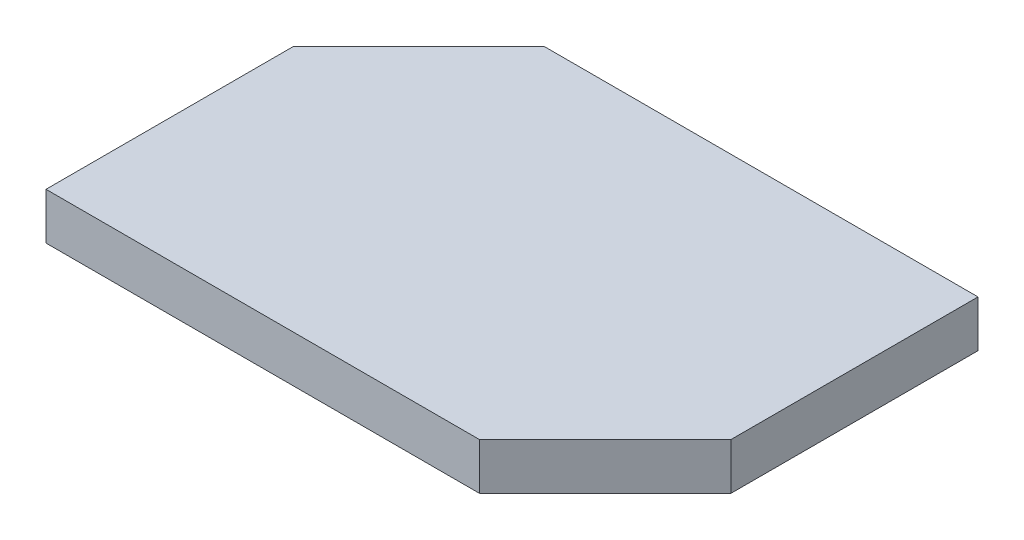
ISO-10303-21;
HEADER;
FILE_DESCRIPTION(('STEP AP214'),'2;1');
FILE_NAME('part.step','',(''),(''),'','','');
FILE_SCHEMA(('AUTOMOTIVE_DESIGN { 1 0 10303 214 1 1 1 1 }'));
ENDSEC;
DATA;
#1=APPLICATION_CONTEXT('core data for automotive mechanical design processes');
#2=APPLICATION_PROTOCOL_DEFINITION('international standard','automotive_design',2000,#1);
#3=PRODUCT_CONTEXT('',#1,'mechanical');
#4=PRODUCT('Part','Part','',(#3));
#5=PRODUCT_RELATED_PRODUCT_CATEGORY('part','',(#4));
#6=PRODUCT_DEFINITION_FORMATION('','',#4);
#7=PRODUCT_DEFINITION_CONTEXT('part definition',#1,'design');
#8=PRODUCT_DEFINITION('design','',#6,#7);
#9=PRODUCT_DEFINITION_SHAPE('','',#8);
#10=(LENGTH_UNIT() NAMED_UNIT(*) SI_UNIT(.MILLI.,.METRE.));
#11=(NAMED_UNIT(*) PLANE_ANGLE_UNIT() SI_UNIT($,.RADIAN.));
#12=(NAMED_UNIT(*) SI_UNIT($,.STERADIAN.) SOLID_ANGLE_UNIT());
#13=UNCERTAINTY_MEASURE_WITH_UNIT(LENGTH_MEASURE(1.E-05),#10,'distance_accuracy_value','');
#14=(GEOMETRIC_REPRESENTATION_CONTEXT(3) GLOBAL_UNCERTAINTY_ASSIGNED_CONTEXT((#13)) GLOBAL_UNIT_ASSIGNED_CONTEXT((#10,
#11,#12)) REPRESENTATION_CONTEXT('',''));
#15=CARTESIAN_POINT('',(0.,0.,0.));
#16=DIRECTION('',(0.,0.,1.));
#17=DIRECTION('',(1.,0.,0.));
#18=AXIS2_PLACEMENT_3D('',#15,#16,#17);
#19=CARTESIAN_POINT('',(-0.6,0.1,-0.4));
#20=DIRECTION('',(1.,0.,0.));
#21=DIRECTION('',(0.,0.,-1.));
#22=AXIS2_PLACEMENT_3D('',#19,#20,#21);
#23=PLANE('',#22);
#24=DIRECTION('',(0.,0.,1.));
#25=VECTOR('',#24,1.);
#26=CARTESIAN_POINT('',(-0.6,0.1,-0.4));
#27=LINE('',#26,#25);
#28=CARTESIAN_POINT('',(-0.6,0.1,-0.13));
#29=VERTEX_POINT('',#28);
#30=CARTESIAN_POINT('',(-0.6,0.1,0.4));
#31=VERTEX_POINT('',#30);
#32=EDGE_CURVE('E84',#29,#31,#27,.T.);
#33=ORIENTED_EDGE('',*,*,#32,.F.);
#34=DIRECTION('',(0.,-1.,0.));
#35=VECTOR('',#34,1.);
#36=CARTESIAN_POINT('',(-0.6,0.1,-0.13));
#37=LINE('',#36,#35);
#38=CARTESIAN_POINT('',(-0.6,0.,-0.13));
#39=VERTEX_POINT('',#38);
#40=EDGE_CURVE('E122',#29,#39,#37,.T.);
#41=ORIENTED_EDGE('',*,*,#40,.T.);
#42=DIRECTION('',(0.,0.,1.));
#43=VECTOR('',#42,1.);
#44=CARTESIAN_POINT('',(-0.6,0.,-0.4));
#45=LINE('',#44,#43);
#46=CARTESIAN_POINT('',(-0.6,0.,0.4));
#47=VERTEX_POINT('',#46);
#48=EDGE_CURVE('E105',#39,#47,#45,.T.);
#49=ORIENTED_EDGE('',*,*,#48,.T.);
#50=DIRECTION('',(0.,-1.,0.));
#51=VECTOR('',#50,1.);
#52=CARTESIAN_POINT('',(-0.6,0.1,0.4));
#53=LINE('',#52,#51);
#54=EDGE_CURVE('E100',#31,#47,#53,.T.);
#55=ORIENTED_EDGE('',*,*,#54,.F.);
#56=EDGE_LOOP('',(#33,#41,#49,#55));
#57=FACE_BOUND('',#56,.T.);
#58=ADVANCED_FACE('F31',(#57),#23,.F.);
#59=CARTESIAN_POINT('',(-0.6,0.1,0.4));
#60=DIRECTION('',(0.,0.,-1.));
#61=DIRECTION('',(-1.,0.,0.));
#62=AXIS2_PLACEMENT_3D('',#59,#60,#61);
#63=PLANE('',#62);
#64=DIRECTION('',(1.,0.,0.));
#65=VECTOR('',#64,1.);
#66=CARTESIAN_POINT('',(-0.6,0.,0.4));
#67=LINE('',#66,#65);
#68=CARTESIAN_POINT('',(0.329999999999999,0.,0.4));
#69=VERTEX_POINT('',#68);
#70=EDGE_CURVE('E126',#47,#69,#67,.T.);
#71=ORIENTED_EDGE('',*,*,#70,.T.);
#72=DIRECTION('',(0.,1.,0.));
#73=VECTOR('',#72,1.);
#74=CARTESIAN_POINT('',(0.329999999999999,0.1,0.4));
#75=LINE('',#74,#73);
#76=CARTESIAN_POINT('',(0.329999999999999,0.1,0.4));
#77=VERTEX_POINT('',#76);
#78=EDGE_CURVE('E102',#69,#77,#75,.T.);
#79=ORIENTED_EDGE('',*,*,#78,.T.);
#80=DIRECTION('',(1.,0.,0.));
#81=VECTOR('',#80,1.);
#82=CARTESIAN_POINT('',(-0.6,0.1,0.4));
#83=LINE('',#82,#81);
#84=EDGE_CURVE('E87',#31,#77,#83,.T.);
#85=ORIENTED_EDGE('',*,*,#84,.F.);
#86=ORIENTED_EDGE('',*,*,#54,.T.);
#87=EDGE_LOOP('',(#71,#79,#85,#86));
#88=FACE_BOUND('',#87,.T.);
#89=ADVANCED_FACE('F99',(#88),#63,.F.);
#90=CARTESIAN_POINT('',(0.6,0.1,-0.4));
#91=DIRECTION('',(-1.,0.,0.));
#92=DIRECTION('',(0.,0.,1.));
#93=AXIS2_PLACEMENT_3D('',#90,#91,#92);
#94=PLANE('',#93);
#95=DIRECTION('',(0.,0.,-1.));
#96=VECTOR('',#95,1.);
#97=CARTESIAN_POINT('',(0.6,0.1,-0.4));
#98=LINE('',#97,#96);
#99=CARTESIAN_POINT('',(0.6,0.1,0.13));
#100=VERTEX_POINT('',#99);
#101=CARTESIAN_POINT('',(0.6,0.1,-0.4));
#102=VERTEX_POINT('',#101);
#103=EDGE_CURVE('E103',#100,#102,#98,.T.);
#104=ORIENTED_EDGE('',*,*,#103,.F.);
#105=DIRECTION('',(0.,-1.,0.));
#106=VECTOR('',#105,1.);
#107=CARTESIAN_POINT('',(0.6,0.1,0.13));
#108=LINE('',#107,#106);
#109=CARTESIAN_POINT('',(0.6,0.,0.13));
#110=VERTEX_POINT('',#109);
#111=EDGE_CURVE('E107',#100,#110,#108,.T.);
#112=ORIENTED_EDGE('',*,*,#111,.T.);
#113=DIRECTION('',(0.,0.,-1.));
#114=VECTOR('',#113,1.);
#115=CARTESIAN_POINT('',(0.6,0.,-0.4));
#116=LINE('',#115,#114);
#117=CARTESIAN_POINT('',(0.6,0.,-0.4));
#118=VERTEX_POINT('',#117);
#119=EDGE_CURVE('E128',#110,#118,#116,.T.);
#120=ORIENTED_EDGE('',*,*,#119,.T.);
#121=DIRECTION('',(0.,-1.,0.));
#122=VECTOR('',#121,1.);
#123=CARTESIAN_POINT('',(0.6,0.1,-0.4));
#124=LINE('',#123,#122);
#125=EDGE_CURVE('E108',#102,#118,#124,.T.);
#126=ORIENTED_EDGE('',*,*,#125,.F.);
#127=EDGE_LOOP('',(#104,#112,#120,#126));
#128=FACE_BOUND('',#127,.T.);
#129=ADVANCED_FACE('F147',(#128),#94,.F.);
#130=CARTESIAN_POINT('',(-0.6,0.1,-0.4));
#131=DIRECTION('',(0.,0.,1.));
#132=DIRECTION('',(1.,0.,0.));
#133=AXIS2_PLACEMENT_3D('',#130,#131,#132);
#134=PLANE('',#133);
#135=DIRECTION('',(-1.,0.,0.));
#136=VECTOR('',#135,1.);
#137=CARTESIAN_POINT('',(-0.6,0.,-0.4));
#138=LINE('',#137,#136);
#139=CARTESIAN_POINT('',(-0.329999999999999,0.,-0.4));
#140=VERTEX_POINT('',#139);
#141=EDGE_CURVE('E94',#118,#140,#138,.T.);
#142=ORIENTED_EDGE('',*,*,#141,.T.);
#143=DIRECTION('',(0.,1.,0.));
#144=VECTOR('',#143,1.);
#145=CARTESIAN_POINT('',(-0.329999999999999,0.1,-0.4));
#146=LINE('',#145,#144);
#147=CARTESIAN_POINT('',(-0.329999999999999,0.1,-0.4));
#148=VERTEX_POINT('',#147);
#149=EDGE_CURVE('E39',#140,#148,#146,.T.);
#150=ORIENTED_EDGE('',*,*,#149,.T.);
#151=DIRECTION('',(-1.,0.,0.));
#152=VECTOR('',#151,1.);
#153=CARTESIAN_POINT('',(-0.6,0.1,-0.4));
#154=LINE('',#153,#152);
#155=EDGE_CURVE('E114',#102,#148,#154,.T.);
#156=ORIENTED_EDGE('',*,*,#155,.F.);
#157=ORIENTED_EDGE('',*,*,#125,.T.);
#158=EDGE_LOOP('',(#142,#150,#156,#157));
#159=FACE_BOUND('',#158,.T.);
#160=ADVANCED_FACE('F133',(#159),#134,.F.);
#161=CARTESIAN_POINT('',(-0.6,0.1,0.4));
#162=DIRECTION('',(0.,1.,0.));
#163=DIRECTION('',(0.,0.,1.));
#164=AXIS2_PLACEMENT_3D('',#161,#162,#163);
#165=PLANE('',#164);
#166=ORIENTED_EDGE('',*,*,#155,.T.);
#167=DIRECTION('',(0.707106781186549,0.,-0.707106781186546));
#168=VECTOR('',#167,1.);
#169=CARTESIAN_POINT('',(-0.865,0.1,0.134999999999999));
#170=LINE('',#169,#168);
#171=EDGE_CURVE('E11',#148,#29,#170,.F.);
#172=ORIENTED_EDGE('',*,*,#171,.T.);
#173=ORIENTED_EDGE('',*,*,#32,.T.);
#174=ORIENTED_EDGE('',*,*,#84,.T.);
#175=DIRECTION('',(-0.707106781186549,0.,0.707106781186546));
#176=VECTOR('',#175,1.);
#177=CARTESIAN_POINT('',(-0.135000000000002,0.1,0.864999999999999));
#178=LINE('',#177,#176);
#179=EDGE_CURVE('E120',#77,#100,#178,.F.);
#180=ORIENTED_EDGE('',*,*,#179,.T.);
#181=ORIENTED_EDGE('',*,*,#103,.T.);
#182=EDGE_LOOP('',(#166,#172,#173,#174,#180,#181));
#183=FACE_BOUND('',#182,.T.);
#184=ADVANCED_FACE('F86',(#183),#165,.T.);
#185=CARTESIAN_POINT('',(-0.6,0.,0.4));
#186=DIRECTION('',(0.,1.,0.));
#187=DIRECTION('',(0.,0.,1.));
#188=AXIS2_PLACEMENT_3D('',#185,#186,#187);
#189=PLANE('',#188);
#190=ORIENTED_EDGE('',*,*,#48,.F.);
#191=DIRECTION('',(-0.707106781186549,0.,0.707106781186546));
#192=VECTOR('',#191,1.);
#193=CARTESIAN_POINT('',(-0.6,0.,-0.13));
#194=LINE('',#193,#192);
#195=EDGE_CURVE('E53',#39,#140,#194,.F.);
#196=ORIENTED_EDGE('',*,*,#195,.T.);
#197=ORIENTED_EDGE('',*,*,#141,.F.);
#198=ORIENTED_EDGE('',*,*,#119,.F.);
#199=DIRECTION('',(0.707106781186549,0.,-0.707106781186546));
#200=VECTOR('',#199,1.);
#201=CARTESIAN_POINT('',(0.6,0.,0.13));
#202=LINE('',#201,#200);
#203=EDGE_CURVE('E111',#110,#69,#202,.F.);
#204=ORIENTED_EDGE('',*,*,#203,.T.);
#205=ORIENTED_EDGE('',*,*,#70,.F.);
#206=EDGE_LOOP('',(#190,#196,#197,#198,#204,#205));
#207=FACE_BOUND('',#206,.T.);
#208=ADVANCED_FACE('F125',(#207),#189,.F.);
#209=CARTESIAN_POINT('',(0.6,0.1,0.13));
#210=DIRECTION('',(-0.707106781186546,0.,-0.707106781186549));
#211=DIRECTION('',(-0.707106781186549,0.,0.707106781186546));
#212=AXIS2_PLACEMENT_3D('',#209,#210,#211);
#213=PLANE('',#212);
#214=ORIENTED_EDGE('',*,*,#179,.F.);
#215=ORIENTED_EDGE('',*,*,#78,.F.);
#216=ORIENTED_EDGE('',*,*,#203,.F.);
#217=ORIENTED_EDGE('',*,*,#111,.F.);
#218=EDGE_LOOP('',(#214,#215,#216,#217));
#219=FACE_BOUND('',#218,.T.);
#220=ADVANCED_FACE('F137',(#219),#213,.F.);
#221=CARTESIAN_POINT('',(-0.6,0.1,-0.13));
#222=DIRECTION('',(0.707106781186546,0.,0.707106781186549));
#223=DIRECTION('',(0.707106781186549,0.,-0.707106781186546));
#224=AXIS2_PLACEMENT_3D('',#221,#222,#223);
#225=PLANE('',#224);
#226=ORIENTED_EDGE('',*,*,#171,.F.);
#227=ORIENTED_EDGE('',*,*,#149,.F.);
#228=ORIENTED_EDGE('',*,*,#195,.F.);
#229=ORIENTED_EDGE('',*,*,#40,.F.);
#230=EDGE_LOOP('',(#226,#227,#228,#229));
#231=FACE_BOUND('',#230,.T.);
#232=ADVANCED_FACE('F33',(#231),#225,.F.);
#233=CLOSED_SHELL('',(#58,#89,#129,#160,#184,#208,#220,#232));
#234=MANIFOLD_SOLID_BREP('B2',#233);
#235=ADVANCED_BREP_SHAPE_REPRESENTATION('',(#18,#234),#14);
#236=SHAPE_DEFINITION_REPRESENTATION(#9,#235);
ENDSEC;
END-ISO-10303-21;
